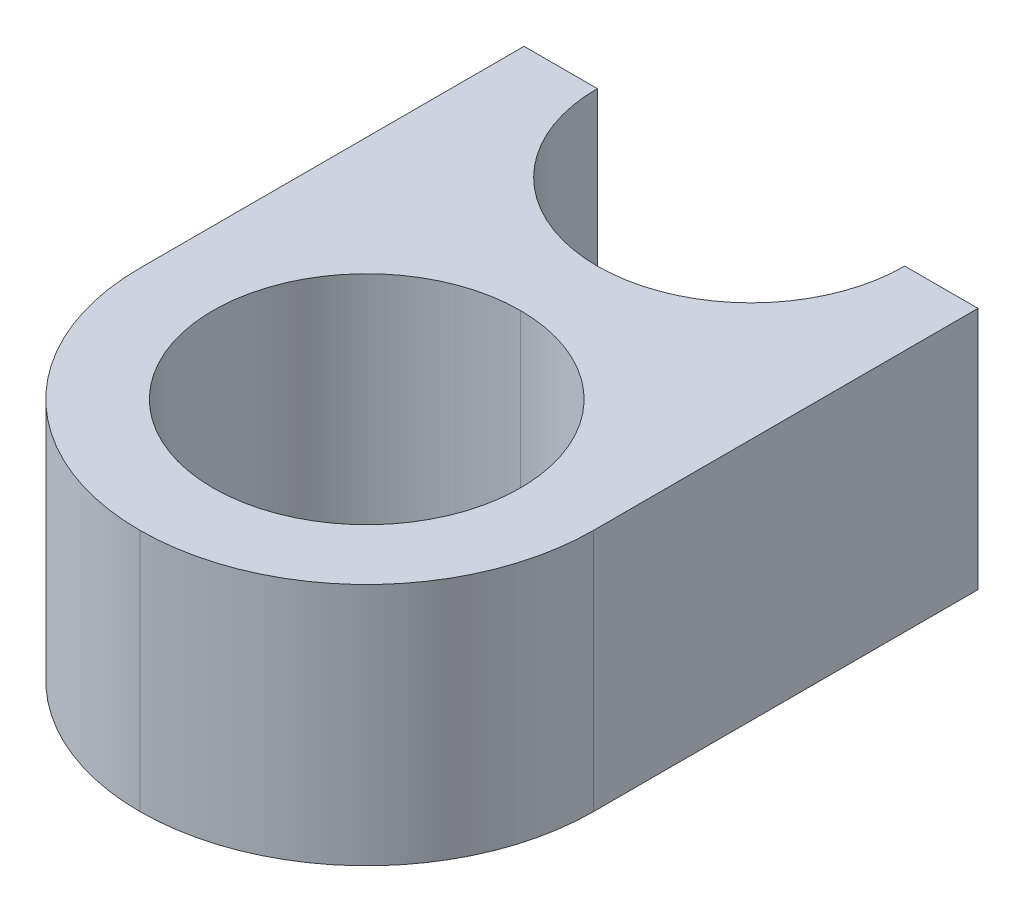
ISO-10303-21;
HEADER;
FILE_DESCRIPTION(('STEP AP214'),'2;1');
FILE_NAME('part.step','',(''),(''),'','','');
FILE_SCHEMA(('AUTOMOTIVE_DESIGN { 1 0 10303 214 1 1 1 1 }'));
ENDSEC;
DATA;
#1=APPLICATION_CONTEXT('core data for automotive mechanical design processes');
#2=APPLICATION_PROTOCOL_DEFINITION('international standard','automotive_design',2000,#1);
#3=PRODUCT_CONTEXT('',#1,'mechanical');
#4=PRODUCT('Part','Part','',(#3));
#5=PRODUCT_RELATED_PRODUCT_CATEGORY('part','',(#4));
#6=PRODUCT_DEFINITION_FORMATION('','',#4);
#7=PRODUCT_DEFINITION_CONTEXT('part definition',#1,'design');
#8=PRODUCT_DEFINITION('design','',#6,#7);
#9=PRODUCT_DEFINITION_SHAPE('','',#8);
#10=(LENGTH_UNIT() NAMED_UNIT(*) SI_UNIT(.MILLI.,.METRE.));
#11=(NAMED_UNIT(*) PLANE_ANGLE_UNIT() SI_UNIT($,.RADIAN.));
#12=(NAMED_UNIT(*) SI_UNIT($,.STERADIAN.) SOLID_ANGLE_UNIT());
#13=UNCERTAINTY_MEASURE_WITH_UNIT(LENGTH_MEASURE(1.E-05),#10,'distance_accuracy_value','');
#14=(GEOMETRIC_REPRESENTATION_CONTEXT(3) GLOBAL_UNCERTAINTY_ASSIGNED_CONTEXT((#13)) GLOBAL_UNIT_ASSIGNED_CONTEXT((#10,
#11,#12)) REPRESENTATION_CONTEXT('',''));
#15=CARTESIAN_POINT('',(0.,0.,0.));
#16=DIRECTION('',(0.,0.,1.));
#17=DIRECTION('',(1.,0.,0.));
#18=AXIS2_PLACEMENT_3D('',#15,#16,#17);
#19=CARTESIAN_POINT('',(-2.54,2.5,-8.89));
#20=DIRECTION('',(0.,1.,0.));
#21=DIRECTION('',(0.,0.,1.));
#22=AXIS2_PLACEMENT_3D('',#19,#20,#21);
#23=CYLINDRICAL_SURFACE('',#22,0.508);
#24=CARTESIAN_POINT('',(-2.54,2.5,-8.89));
#25=DIRECTION('',(0.,-1.,0.));
#26=DIRECTION('',(0.,0.,1.));
#27=AXIS2_PLACEMENT_3D('',#24,#25,#26);
#28=CIRCLE('',#27,0.508);
#29=CARTESIAN_POINT('',(-2.032,2.5,-8.89));
#30=VERTEX_POINT('',#29);
#31=CARTESIAN_POINT('',(-2.54,2.5,-8.382));
#32=VERTEX_POINT('',#31);
#33=EDGE_CURVE('E11',#30,#32,#28,.T.);
#34=ORIENTED_EDGE('',*,*,#33,.T.);
#35=DIRECTION('',(0.,1.,0.));
#36=VECTOR('',#35,1.);
#37=CARTESIAN_POINT('',(-2.54,2.5,-8.382));
#38=LINE('',#37,#36);
#39=CARTESIAN_POINT('',(-2.54,3.305,-8.382));
#40=VERTEX_POINT('',#39);
#41=EDGE_CURVE('E24',#32,#40,#38,.T.);
#42=ORIENTED_EDGE('',*,*,#41,.T.);
#43=CARTESIAN_POINT('',(-2.54,3.305,-8.89));
#44=DIRECTION('',(0.,-1.,0.));
#45=DIRECTION('',(0.,0.,1.));
#46=AXIS2_PLACEMENT_3D('',#43,#44,#45);
#47=CIRCLE('',#46,0.508);
#48=CARTESIAN_POINT('',(-2.032,3.305,-8.89));
#49=VERTEX_POINT('',#48);
#50=EDGE_CURVE('E172',#49,#40,#47,.T.);
#51=ORIENTED_EDGE('',*,*,#50,.F.);
#52=DIRECTION('',(0.,1.,0.));
#53=VECTOR('',#52,1.);
#54=CARTESIAN_POINT('',(-2.032,2.5,-8.89));
#55=LINE('',#54,#53);
#56=EDGE_CURVE('E36',#30,#49,#55,.T.);
#57=ORIENTED_EDGE('',*,*,#56,.F.);
#58=EDGE_LOOP('',(#34,#42,#51,#57));
#59=FACE_BOUND('',#58,.T.);
#60=ADVANCED_FACE('F17',(#59),#23,.F.);
#61=CARTESIAN_POINT('',(-2.54,2.5,-7.62));
#62=DIRECTION('',(0.,1.,0.));
#63=DIRECTION('',(0.,0.,1.));
#64=AXIS2_PLACEMENT_3D('',#61,#62,#63);
#65=CYLINDRICAL_SURFACE('',#64,0.75);
#66=CARTESIAN_POINT('',(-2.54,2.5,-7.62));
#67=DIRECTION('',(0.,1.,0.));
#68=DIRECTION('',(0.,0.,1.));
#69=AXIS2_PLACEMENT_3D('',#66,#67,#68);
#70=CIRCLE('',#69,0.75);
#71=CARTESIAN_POINT('',(-3.29,2.5,-7.62));
#72=VERTEX_POINT('',#71);
#73=CARTESIAN_POINT('',(-2.54,2.5,-6.87));
#74=VERTEX_POINT('',#73);
#75=EDGE_CURVE('E169',#72,#74,#70,.T.);
#76=ORIENTED_EDGE('',*,*,#75,.T.);
#77=DIRECTION('',(0.,1.,0.));
#78=VECTOR('',#77,1.);
#79=CARTESIAN_POINT('',(-2.54,2.5,-6.87));
#80=LINE('',#79,#78);
#81=CARTESIAN_POINT('',(-2.54,3.305,-6.87));
#82=VERTEX_POINT('',#81);
#83=EDGE_CURVE('E167',#74,#82,#80,.T.);
#84=ORIENTED_EDGE('',*,*,#83,.T.);
#85=CARTESIAN_POINT('',(-2.54,3.305,-7.62));
#86=DIRECTION('',(0.,1.,0.));
#87=DIRECTION('',(0.,0.,1.));
#88=AXIS2_PLACEMENT_3D('',#85,#86,#87);
#89=CIRCLE('',#88,0.75);
#90=CARTESIAN_POINT('',(-3.29,3.305,-7.62));
#91=VERTEX_POINT('',#90);
#92=EDGE_CURVE('E164',#91,#82,#89,.T.);
#93=ORIENTED_EDGE('',*,*,#92,.F.);
#94=DIRECTION('',(0.,-1.,0.));
#95=VECTOR('',#94,1.);
#96=CARTESIAN_POINT('',(-3.29,2.5,-7.62));
#97=LINE('',#96,#95);
#98=EDGE_CURVE('E161',#91,#72,#97,.T.);
#99=ORIENTED_EDGE('',*,*,#98,.T.);
#100=EDGE_LOOP('',(#76,#84,#93,#99));
#101=FACE_BOUND('',#100,.T.);
#102=ADVANCED_FACE('F190',(#101),#65,.T.);
#103=CARTESIAN_POINT('',(-2.54,2.5,-7.62));
#104=DIRECTION('',(0.,1.,0.));
#105=DIRECTION('',(0.,0.,1.));
#106=AXIS2_PLACEMENT_3D('',#103,#104,#105);
#107=CYLINDRICAL_SURFACE('',#106,0.508);
#108=CARTESIAN_POINT('',(-2.54,2.5,-7.62));
#109=DIRECTION('',(0.,1.,0.));
#110=DIRECTION('',(0.,0.,1.));
#111=AXIS2_PLACEMENT_3D('',#108,#109,#110);
#112=CIRCLE('',#111,0.508);
#113=CARTESIAN_POINT('',(-2.54,2.5,-8.128));
#114=VERTEX_POINT('',#113);
#115=CARTESIAN_POINT('',(-2.54,2.5,-7.112));
#116=VERTEX_POINT('',#115);
#117=EDGE_CURVE('E158',#114,#116,#112,.T.);
#118=ORIENTED_EDGE('',*,*,#117,.F.);
#119=DIRECTION('',(0.,1.,0.));
#120=VECTOR('',#119,1.);
#121=CARTESIAN_POINT('',(-2.54,2.5,-8.128));
#122=LINE('',#121,#120);
#123=CARTESIAN_POINT('',(-2.54,3.305,-8.128));
#124=VERTEX_POINT('',#123);
#125=EDGE_CURVE('E155',#114,#124,#122,.T.);
#126=ORIENTED_EDGE('',*,*,#125,.T.);
#127=CARTESIAN_POINT('',(-2.54,3.305,-7.62));
#128=DIRECTION('',(0.,-1.,0.));
#129=DIRECTION('',(0.,0.,1.));
#130=AXIS2_PLACEMENT_3D('',#127,#128,#129);
#131=CIRCLE('',#130,0.508);
#132=CARTESIAN_POINT('',(-2.54,3.305,-7.112));
#133=VERTEX_POINT('',#132);
#134=EDGE_CURVE('E153',#133,#124,#131,.T.);
#135=ORIENTED_EDGE('',*,*,#134,.F.);
#136=DIRECTION('',(0.,1.,0.));
#137=VECTOR('',#136,1.);
#138=CARTESIAN_POINT('',(-2.54,2.5,-7.112));
#139=LINE('',#138,#137);
#140=EDGE_CURVE('E151',#116,#133,#139,.T.);
#141=ORIENTED_EDGE('',*,*,#140,.F.);
#142=EDGE_LOOP('',(#118,#126,#135,#141));
#143=FACE_BOUND('',#142,.T.);
#144=ADVANCED_FACE('F207',(#143),#107,.F.);
#145=CARTESIAN_POINT('',(-2.54,2.5,-7.62));
#146=DIRECTION('',(0.,1.,0.));
#147=DIRECTION('',(0.,0.,1.));
#148=AXIS2_PLACEMENT_3D('',#145,#146,#147);
#149=CYLINDRICAL_SURFACE('',#148,0.508);
#150=ORIENTED_EDGE('',*,*,#125,.F.);
#151=CARTESIAN_POINT('',(-2.54,2.5,-7.62));
#152=DIRECTION('',(0.,1.,0.));
#153=DIRECTION('',(0.,0.,1.));
#154=AXIS2_PLACEMENT_3D('',#151,#152,#153);
#155=CIRCLE('',#154,0.508);
#156=EDGE_CURVE('E148',#116,#114,#155,.T.);
#157=ORIENTED_EDGE('',*,*,#156,.F.);
#158=ORIENTED_EDGE('',*,*,#140,.T.);
#159=CARTESIAN_POINT('',(-2.54,3.305,-7.62));
#160=DIRECTION('',(0.,-1.,0.));
#161=DIRECTION('',(0.,0.,1.));
#162=AXIS2_PLACEMENT_3D('',#159,#160,#161);
#163=CIRCLE('',#162,0.508);
#164=EDGE_CURVE('E145',#124,#133,#163,.T.);
#165=ORIENTED_EDGE('',*,*,#164,.F.);
#166=EDGE_LOOP('',(#150,#157,#158,#165));
#167=FACE_BOUND('',#166,.T.);
#168=ADVANCED_FACE('F211',(#167),#149,.F.);
#169=CARTESIAN_POINT('',(-2.54,3.305,-8.89));
#170=DIRECTION('',(0.,1.,0.));
#171=DIRECTION('',(1.,0.,0.));
#172=AXIS2_PLACEMENT_3D('',#169,#170,#171);
#173=PLANE('',#172);
#174=DIRECTION('',(0.,0.,-1.));
#175=VECTOR('',#174,1.);
#176=CARTESIAN_POINT('',(-1.79,3.305,-8.89));
#177=LINE('',#176,#175);
#178=CARTESIAN_POINT('',(-1.79,3.305,-7.62));
#179=VERTEX_POINT('',#178);
#180=CARTESIAN_POINT('',(-1.79,3.305,-8.89));
#181=VERTEX_POINT('',#180);
#182=EDGE_CURVE('E143',#179,#181,#177,.T.);
#183=ORIENTED_EDGE('',*,*,#182,.T.);
#184=DIRECTION('',(-1.,0.,0.));
#185=VECTOR('',#184,1.);
#186=CARTESIAN_POINT('',(-2.54,3.305,-8.89));
#187=LINE('',#186,#185);
#188=EDGE_CURVE('E140',#181,#49,#187,.T.);
#189=ORIENTED_EDGE('',*,*,#188,.T.);
#190=ORIENTED_EDGE('',*,*,#50,.T.);
#191=CARTESIAN_POINT('',(-2.54,3.305,-8.89));
#192=DIRECTION('',(0.,-1.,0.));
#193=DIRECTION('',(0.,0.,1.));
#194=AXIS2_PLACEMENT_3D('',#191,#192,#193);
#195=CIRCLE('',#194,0.508);
#196=CARTESIAN_POINT('',(-3.048,3.305,-8.89));
#197=VERTEX_POINT('',#196);
#198=EDGE_CURVE('E138',#40,#197,#195,.T.);
#199=ORIENTED_EDGE('',*,*,#198,.T.);
#200=DIRECTION('',(-1.,0.,0.));
#201=VECTOR('',#200,1.);
#202=CARTESIAN_POINT('',(-2.54,3.305,-8.89));
#203=LINE('',#202,#201);
#204=CARTESIAN_POINT('',(-3.29,3.305,-8.89));
#205=VERTEX_POINT('',#204);
#206=EDGE_CURVE('E111',#197,#205,#203,.T.);
#207=ORIENTED_EDGE('',*,*,#206,.T.);
#208=DIRECTION('',(0.,0.,1.));
#209=VECTOR('',#208,1.);
#210=CARTESIAN_POINT('',(-3.29,3.305,-8.89));
#211=LINE('',#210,#209);
#212=EDGE_CURVE('E134',#205,#91,#211,.T.);
#213=ORIENTED_EDGE('',*,*,#212,.T.);
#214=ORIENTED_EDGE('',*,*,#92,.T.);
#215=CARTESIAN_POINT('',(-2.54,3.305,-7.62));
#216=DIRECTION('',(0.,1.,0.));
#217=DIRECTION('',(0.,0.,1.));
#218=AXIS2_PLACEMENT_3D('',#215,#216,#217);
#219=CIRCLE('',#218,0.75);
#220=EDGE_CURVE('E131',#82,#179,#219,.T.);
#221=ORIENTED_EDGE('',*,*,#220,.T.);
#222=EDGE_LOOP('',(#183,#189,#190,#199,#207,#213,#214,#221));
#223=FACE_BOUND('',#222,.T.);
#224=ORIENTED_EDGE('',*,*,#134,.T.);
#225=ORIENTED_EDGE('',*,*,#164,.T.);
#226=EDGE_LOOP('',(#224,#225));
#227=FACE_BOUND('',#226,.T.);
#228=ADVANCED_FACE('F174',(#223,#227),#173,.T.);
#229=CARTESIAN_POINT('',(-2.54,2.5,-8.89));
#230=DIRECTION('',(0.,1.,0.));
#231=DIRECTION('',(1.,0.,0.));
#232=AXIS2_PLACEMENT_3D('',#229,#230,#231);
#233=PLANE('',#232);
#234=DIRECTION('',(-1.,0.,0.));
#235=VECTOR('',#234,1.);
#236=CARTESIAN_POINT('',(-2.54,2.5,-8.89));
#237=LINE('',#236,#235);
#238=CARTESIAN_POINT('',(-1.79,2.5,-8.89));
#239=VERTEX_POINT('',#238);
#240=EDGE_CURVE('E128',#239,#30,#237,.T.);
#241=ORIENTED_EDGE('',*,*,#240,.F.);
#242=DIRECTION('',(0.,0.,-1.));
#243=VECTOR('',#242,1.);
#244=CARTESIAN_POINT('',(-1.79,2.5,-8.89));
#245=LINE('',#244,#243);
#246=CARTESIAN_POINT('',(-1.79,2.5,-7.62));
#247=VERTEX_POINT('',#246);
#248=EDGE_CURVE('E125',#247,#239,#245,.T.);
#249=ORIENTED_EDGE('',*,*,#248,.F.);
#250=CARTESIAN_POINT('',(-2.54,2.5,-7.62));
#251=DIRECTION('',(0.,1.,0.));
#252=DIRECTION('',(0.,0.,1.));
#253=AXIS2_PLACEMENT_3D('',#250,#251,#252);
#254=CIRCLE('',#253,0.75);
#255=EDGE_CURVE('E122',#74,#247,#254,.T.);
#256=ORIENTED_EDGE('',*,*,#255,.F.);
#257=ORIENTED_EDGE('',*,*,#75,.F.);
#258=DIRECTION('',(0.,0.,1.));
#259=VECTOR('',#258,1.);
#260=CARTESIAN_POINT('',(-3.29,2.5,-8.89));
#261=LINE('',#260,#259);
#262=CARTESIAN_POINT('',(-3.29,2.5,-8.89));
#263=VERTEX_POINT('',#262);
#264=EDGE_CURVE('E98',#263,#72,#261,.T.);
#265=ORIENTED_EDGE('',*,*,#264,.F.);
#266=DIRECTION('',(-1.,0.,0.));
#267=VECTOR('',#266,1.);
#268=CARTESIAN_POINT('',(-2.54,2.5,-8.89));
#269=LINE('',#268,#267);
#270=CARTESIAN_POINT('',(-3.048,2.5,-8.89));
#271=VERTEX_POINT('',#270);
#272=EDGE_CURVE('E93',#271,#263,#269,.T.);
#273=ORIENTED_EDGE('',*,*,#272,.F.);
#274=CARTESIAN_POINT('',(-2.54,2.5,-8.89));
#275=DIRECTION('',(0.,-1.,0.));
#276=DIRECTION('',(0.,0.,1.));
#277=AXIS2_PLACEMENT_3D('',#274,#275,#276);
#278=CIRCLE('',#277,0.508);
#279=EDGE_CURVE('E96',#32,#271,#278,.T.);
#280=ORIENTED_EDGE('',*,*,#279,.F.);
#281=ORIENTED_EDGE('',*,*,#33,.F.);
#282=EDGE_LOOP('',(#241,#249,#256,#257,#265,#273,#280,#281));
#283=FACE_BOUND('',#282,.T.);
#284=ORIENTED_EDGE('',*,*,#156,.T.);
#285=ORIENTED_EDGE('',*,*,#117,.T.);
#286=EDGE_LOOP('',(#284,#285));
#287=FACE_BOUND('',#286,.T.);
#288=ADVANCED_FACE('F94',(#283,#287),#233,.F.);
#289=CARTESIAN_POINT('',(-2.032,2.5,-8.89));
#290=DIRECTION('',(-2.65226316574968E-13,0.,-1.));
#291=DIRECTION('',(-1.,0.,2.65226316574968E-13));
#292=AXIS2_PLACEMENT_3D('',#289,#290,#291);
#293=PLANE('',#292);
#294=ORIENTED_EDGE('',*,*,#240,.T.);
#295=ORIENTED_EDGE('',*,*,#56,.T.);
#296=ORIENTED_EDGE('',*,*,#188,.F.);
#297=DIRECTION('',(0.,-1.,0.));
#298=VECTOR('',#297,1.);
#299=CARTESIAN_POINT('',(-1.79,2.5,-8.89));
#300=LINE('',#299,#298);
#301=EDGE_CURVE('E107',#181,#239,#300,.T.);
#302=ORIENTED_EDGE('',*,*,#301,.T.);
#303=EDGE_LOOP('',(#294,#295,#296,#302));
#304=FACE_BOUND('',#303,.T.);
#305=ADVANCED_FACE('F180',(#304),#293,.T.);
#306=CARTESIAN_POINT('',(-1.79,2.5,-8.89));
#307=DIRECTION('',(1.,0.,0.));
#308=DIRECTION('',(0.,1.,0.));
#309=AXIS2_PLACEMENT_3D('',#306,#307,#308);
#310=PLANE('',#309);
#311=ORIENTED_EDGE('',*,*,#248,.T.);
#312=ORIENTED_EDGE('',*,*,#301,.F.);
#313=ORIENTED_EDGE('',*,*,#182,.F.);
#314=DIRECTION('',(0.,-1.,0.));
#315=VECTOR('',#314,1.);
#316=CARTESIAN_POINT('',(-1.79,2.5,-7.62));
#317=LINE('',#316,#315);
#318=EDGE_CURVE('E114',#179,#247,#317,.T.);
#319=ORIENTED_EDGE('',*,*,#318,.T.);
#320=EDGE_LOOP('',(#311,#312,#313,#319));
#321=FACE_BOUND('',#320,.T.);
#322=ADVANCED_FACE('F182',(#321),#310,.T.);
#323=CARTESIAN_POINT('',(-2.54,2.5,-7.62));
#324=DIRECTION('',(0.,1.,0.));
#325=DIRECTION('',(0.,0.,1.));
#326=AXIS2_PLACEMENT_3D('',#323,#324,#325);
#327=CYLINDRICAL_SURFACE('',#326,0.75);
#328=ORIENTED_EDGE('',*,*,#83,.F.);
#329=ORIENTED_EDGE('',*,*,#255,.T.);
#330=ORIENTED_EDGE('',*,*,#318,.F.);
#331=ORIENTED_EDGE('',*,*,#220,.F.);
#332=EDGE_LOOP('',(#328,#329,#330,#331));
#333=FACE_BOUND('',#332,.T.);
#334=ADVANCED_FACE('F187',(#333),#327,.T.);
#335=CARTESIAN_POINT('',(-3.29,2.5,-8.89));
#336=DIRECTION('',(-1.,0.,0.));
#337=DIRECTION('',(0.,0.,1.));
#338=AXIS2_PLACEMENT_3D('',#335,#336,#337);
#339=PLANE('',#338);
#340=ORIENTED_EDGE('',*,*,#264,.T.);
#341=ORIENTED_EDGE('',*,*,#98,.F.);
#342=ORIENTED_EDGE('',*,*,#212,.F.);
#343=DIRECTION('',(0.,-1.,0.));
#344=VECTOR('',#343,1.);
#345=CARTESIAN_POINT('',(-3.29,2.5,-8.89));
#346=LINE('',#345,#344);
#347=EDGE_CURVE('E112',#205,#263,#346,.T.);
#348=ORIENTED_EDGE('',*,*,#347,.T.);
#349=EDGE_LOOP('',(#340,#341,#342,#348));
#350=FACE_BOUND('',#349,.T.);
#351=ADVANCED_FACE('F193',(#350),#339,.T.);
#352=CARTESIAN_POINT('',(-3.048,2.5,-8.89));
#353=DIRECTION('',(1.86375249485112E-13,0.,-1.));
#354=DIRECTION('',(0.,-1.,0.));
#355=AXIS2_PLACEMENT_3D('',#352,#353,#354);
#356=PLANE('',#355);
#357=ORIENTED_EDGE('',*,*,#272,.T.);
#358=ORIENTED_EDGE('',*,*,#347,.F.);
#359=ORIENTED_EDGE('',*,*,#206,.F.);
#360=DIRECTION('',(0.,-1.,0.));
#361=VECTOR('',#360,1.);
#362=CARTESIAN_POINT('',(-3.048,2.5,-8.89));
#363=LINE('',#362,#361);
#364=EDGE_CURVE('E106',#197,#271,#363,.T.);
#365=ORIENTED_EDGE('',*,*,#364,.T.);
#366=EDGE_LOOP('',(#357,#358,#359,#365));
#367=FACE_BOUND('',#366,.T.);
#368=ADVANCED_FACE('F110',(#367),#356,.T.);
#369=CARTESIAN_POINT('',(-2.54,2.5,-8.89));
#370=DIRECTION('',(0.,1.,0.));
#371=DIRECTION('',(0.,0.,1.));
#372=AXIS2_PLACEMENT_3D('',#369,#370,#371);
#373=CYLINDRICAL_SURFACE('',#372,0.508);
#374=ORIENTED_EDGE('',*,*,#41,.F.);
#375=ORIENTED_EDGE('',*,*,#279,.T.);
#376=ORIENTED_EDGE('',*,*,#364,.F.);
#377=ORIENTED_EDGE('',*,*,#198,.F.);
#378=EDGE_LOOP('',(#374,#375,#376,#377));
#379=FACE_BOUND('',#378,.T.);
#380=ADVANCED_FACE('F105',(#379),#373,.F.);
#381=CLOSED_SHELL('',(#60,#102,#144,#168,#228,#288,#305,#322,#334,#351,#368,#380));
#382=MANIFOLD_SOLID_BREP('B1',#381);
#383=ADVANCED_BREP_SHAPE_REPRESENTATION('',(#18,#382),#14);
#384=SHAPE_DEFINITION_REPRESENTATION(#9,#383);
ENDSEC;
END-ISO-10303-21;
